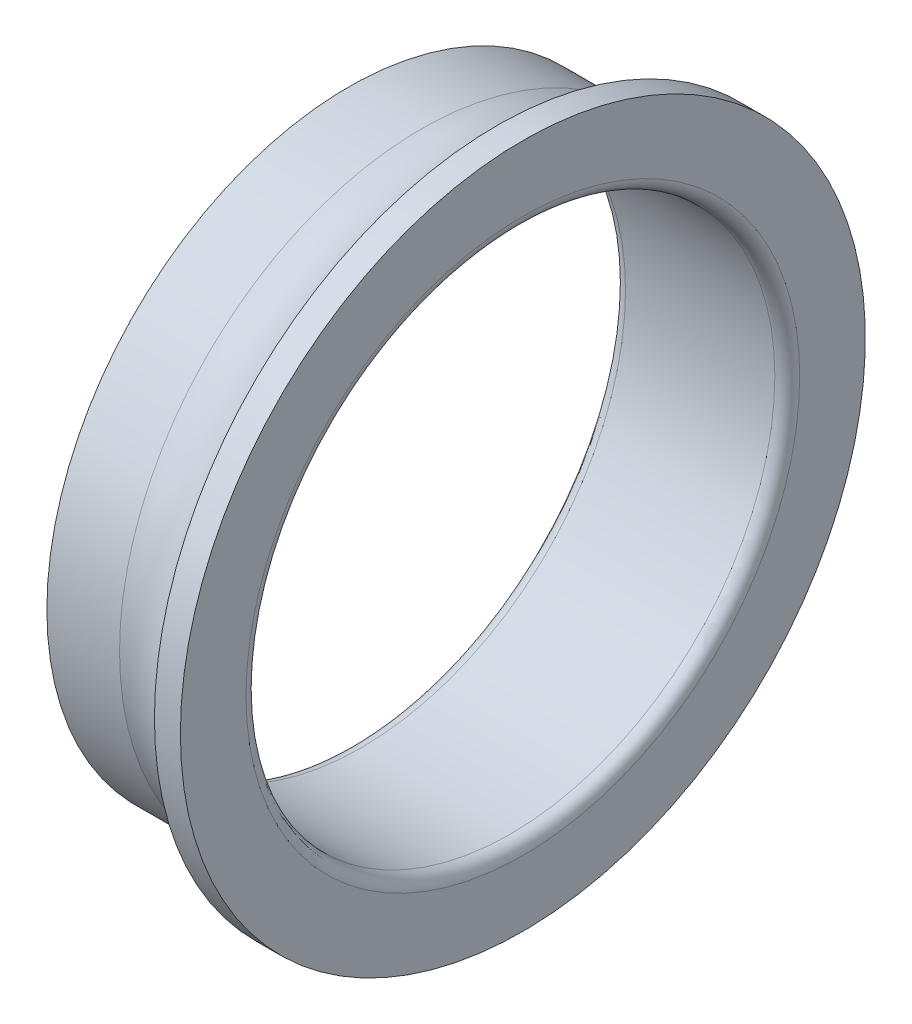
ISO-10303-21;
HEADER;
FILE_DESCRIPTION(('STEP AP214'),'2;1');
FILE_NAME('part.step','',(''),(''),'','','');
FILE_SCHEMA(('AUTOMOTIVE_DESIGN { 1 0 10303 214 1 1 1 1 }'));
ENDSEC;
DATA;
#1=APPLICATION_CONTEXT('core data for automotive mechanical design processes');
#2=APPLICATION_PROTOCOL_DEFINITION('international standard','automotive_design',2000,#1);
#3=PRODUCT_CONTEXT('',#1,'mechanical');
#4=PRODUCT('Part','Part','',(#3));
#5=PRODUCT_RELATED_PRODUCT_CATEGORY('part','',(#4));
#6=PRODUCT_DEFINITION_FORMATION('','',#4);
#7=PRODUCT_DEFINITION_CONTEXT('part definition',#1,'design');
#8=PRODUCT_DEFINITION('design','',#6,#7);
#9=PRODUCT_DEFINITION_SHAPE('','',#8);
#10=(LENGTH_UNIT() NAMED_UNIT(*) SI_UNIT(.MILLI.,.METRE.));
#11=(NAMED_UNIT(*) PLANE_ANGLE_UNIT() SI_UNIT($,.RADIAN.));
#12=(NAMED_UNIT(*) SI_UNIT($,.STERADIAN.) SOLID_ANGLE_UNIT());
#13=UNCERTAINTY_MEASURE_WITH_UNIT(LENGTH_MEASURE(1.E-05),#10,'distance_accuracy_value','');
#14=(GEOMETRIC_REPRESENTATION_CONTEXT(3) GLOBAL_UNCERTAINTY_ASSIGNED_CONTEXT((#13)) GLOBAL_UNIT_ASSIGNED_CONTEXT((#10,
#11,#12)) REPRESENTATION_CONTEXT('',''));
#15=CARTESIAN_POINT('',(0.,0.,0.));
#16=DIRECTION('',(0.,0.,1.));
#17=DIRECTION('',(1.,0.,0.));
#18=AXIS2_PLACEMENT_3D('',#15,#16,#17);
#19=CARTESIAN_POINT('',(28.,0.,0.));
#20=DIRECTION('',(-1.,0.,0.));
#21=DIRECTION('',(0.,0.,1.));
#22=AXIS2_PLACEMENT_3D('',#19,#20,#21);
#23=CYLINDRICAL_SURFACE('',#22,48.51);
#24=CARTESIAN_POINT('',(0.,0.,0.));
#25=DIRECTION('',(-1.,0.,0.));
#26=DIRECTION('',(0.,0.,1.));
#27=AXIS2_PLACEMENT_3D('',#24,#25,#26);
#28=CIRCLE('',#27,48.51);
#29=CARTESIAN_POINT('',(0.,0.,48.51));
#30=VERTEX_POINT('',#29);
#31=EDGE_CURVE('E10',#30,#30,#28,.T.);
#32=ORIENTED_EDGE('',*,*,#31,.F.);
#33=EDGE_LOOP('',(#32));
#34=FACE_BOUND('',#33,.T.);
#35=CARTESIAN_POINT('',(11.677845827685,0.,0.));
#36=DIRECTION('',(-1.,0.,0.));
#37=DIRECTION('',(0.,0.,1.));
#38=AXIS2_PLACEMENT_3D('',#35,#36,#37);
#39=CIRCLE('',#38,48.51);
#40=CARTESIAN_POINT('',(11.677845827685,0.,48.51));
#41=VERTEX_POINT('',#40);
#42=EDGE_CURVE('E59',#41,#41,#39,.T.);
#43=ORIENTED_EDGE('',*,*,#42,.T.);
#44=EDGE_LOOP('',(#43));
#45=FACE_BOUND('',#44,.T.);
#46=ADVANCED_FACE('F31',(#34,#45),#23,.T.);
#47=CARTESIAN_POINT('',(0.,48.51,0.));
#48=DIRECTION('',(1.,0.,0.));
#49=DIRECTION('',(0.,0.,-1.));
#50=AXIS2_PLACEMENT_3D('',#47,#48,#49);
#51=PLANE('',#50);
#52=CARTESIAN_POINT('',(0.,0.,0.));
#53=DIRECTION('',(-1.,0.,0.));
#54=DIRECTION('',(0.,0.,1.));
#55=AXIS2_PLACEMENT_3D('',#52,#53,#54);
#56=CIRCLE('',#55,44.5);
#57=CARTESIAN_POINT('',(0.,0.,44.5));
#58=VERTEX_POINT('',#57);
#59=EDGE_CURVE('E37',#58,#58,#56,.T.);
#60=ORIENTED_EDGE('',*,*,#59,.F.);
#61=EDGE_LOOP('',(#60));
#62=FACE_BOUND('',#61,.T.);
#63=ORIENTED_EDGE('',*,*,#31,.T.);
#64=EDGE_LOOP('',(#63));
#65=FACE_BOUND('',#64,.T.);
#66=ADVANCED_FACE('F96',(#62,#65),#51,.F.);
#67=CARTESIAN_POINT('',(2.00000000000014,0.,0.));
#68=DIRECTION('',(-1.,0.,0.));
#69=DIRECTION('',(0.,0.,1.));
#70=AXIS2_PLACEMENT_3D('',#67,#68,#69);
#71=TOROIDAL_SURFACE('',#70,44.5000000000001,2.00000000000014);
#72=CARTESIAN_POINT('',(2.,0.,0.));
#73=DIRECTION('',(-1.,0.,0.));
#74=DIRECTION('',(0.,0.,1.));
#75=AXIS2_PLACEMENT_3D('',#72,#73,#74);
#76=CIRCLE('',#75,42.5);
#77=CARTESIAN_POINT('',(2.,0.,42.5));
#78=VERTEX_POINT('',#77);
#79=EDGE_CURVE('E41',#78,#78,#76,.T.);
#80=ORIENTED_EDGE('',*,*,#79,.F.);
#81=EDGE_LOOP('',(#80));
#82=FACE_BOUND('',#81,.T.);
#83=ORIENTED_EDGE('',*,*,#59,.T.);
#84=EDGE_LOOP('',(#83));
#85=FACE_BOUND('',#84,.T.);
#86=ADVANCED_FACE('F91',(#82,#85),#71,.T.);
#87=CARTESIAN_POINT('',(28.,0.,0.));
#88=DIRECTION('',(-1.,0.,0.));
#89=DIRECTION('',(0.,0.,1.));
#90=AXIS2_PLACEMENT_3D('',#87,#88,#89);
#91=CYLINDRICAL_SURFACE('',#90,42.5);
#92=CARTESIAN_POINT('',(26.,0.,0.));
#93=DIRECTION('',(-1.,0.,0.));
#94=DIRECTION('',(0.,0.,1.));
#95=AXIS2_PLACEMENT_3D('',#92,#93,#94);
#96=CIRCLE('',#95,42.5);
#97=CARTESIAN_POINT('',(26.,0.,42.5));
#98=VERTEX_POINT('',#97);
#99=EDGE_CURVE('E45',#98,#98,#96,.T.);
#100=ORIENTED_EDGE('',*,*,#99,.F.);
#101=EDGE_LOOP('',(#100));
#102=FACE_BOUND('',#101,.T.);
#103=ORIENTED_EDGE('',*,*,#79,.T.);
#104=EDGE_LOOP('',(#103));
#105=FACE_BOUND('',#104,.T.);
#106=ADVANCED_FACE('F85',(#102,#105),#91,.F.);
#107=CARTESIAN_POINT('',(25.9999999999997,0.,0.));
#108=DIRECTION('',(-1.,0.,0.));
#109=DIRECTION('',(0.,0.,1.));
#110=AXIS2_PLACEMENT_3D('',#107,#108,#109);
#111=TOROIDAL_SURFACE('',#110,44.5000000000003,2.00000000000032);
#112=CARTESIAN_POINT('',(28.,0.,0.));
#113=DIRECTION('',(-1.,0.,0.));
#114=DIRECTION('',(0.,0.,1.));
#115=AXIS2_PLACEMENT_3D('',#112,#113,#114);
#116=CIRCLE('',#115,44.5);
#117=CARTESIAN_POINT('',(28.,0.,44.5));
#118=VERTEX_POINT('',#117);
#119=EDGE_CURVE('E50',#118,#118,#116,.T.);
#120=ORIENTED_EDGE('',*,*,#119,.F.);
#121=EDGE_LOOP('',(#120));
#122=FACE_BOUND('',#121,.T.);
#123=ORIENTED_EDGE('',*,*,#99,.T.);
#124=EDGE_LOOP('',(#123));
#125=FACE_BOUND('',#124,.T.);
#126=ADVANCED_FACE('F79',(#122,#125),#111,.T.);
#127=CARTESIAN_POINT('',(28.,44.5,0.));
#128=DIRECTION('',(-1.,0.,0.));
#129=DIRECTION('',(0.,0.,1.));
#130=AXIS2_PLACEMENT_3D('',#127,#128,#129);
#131=PLANE('',#130);
#132=CARTESIAN_POINT('',(28.,0.,0.));
#133=DIRECTION('',(-1.,0.,0.));
#134=DIRECTION('',(0.,0.,1.));
#135=AXIS2_PLACEMENT_3D('',#132,#133,#134);
#136=CIRCLE('',#135,55.05);
#137=CARTESIAN_POINT('',(28.,0.,55.05));
#138=VERTEX_POINT('',#137);
#139=EDGE_CURVE('E53',#138,#138,#136,.T.);
#140=ORIENTED_EDGE('',*,*,#139,.F.);
#141=EDGE_LOOP('',(#140));
#142=FACE_BOUND('',#141,.T.);
#143=ORIENTED_EDGE('',*,*,#119,.T.);
#144=EDGE_LOOP('',(#143));
#145=FACE_BOUND('',#144,.T.);
#146=ADVANCED_FACE('F73',(#142,#145),#131,.F.);
#147=CARTESIAN_POINT('',(28.,0.,0.));
#148=DIRECTION('',(-1.,0.,0.));
#149=DIRECTION('',(0.,0.,1.));
#150=AXIS2_PLACEMENT_3D('',#147,#148,#149);
#151=CYLINDRICAL_SURFACE('',#150,55.05);
#152=CARTESIAN_POINT('',(23.826494797231,0.,0.));
#153=DIRECTION('',(-1.,0.,0.));
#154=DIRECTION('',(0.,0.,1.));
#155=AXIS2_PLACEMENT_3D('',#152,#153,#154);
#156=CIRCLE('',#155,55.05);
#157=CARTESIAN_POINT('',(23.826494797231,0.,55.05));
#158=VERTEX_POINT('',#157);
#159=EDGE_CURVE('E56',#158,#158,#156,.T.);
#160=ORIENTED_EDGE('',*,*,#159,.F.);
#161=EDGE_LOOP('',(#160));
#162=FACE_BOUND('',#161,.T.);
#163=ORIENTED_EDGE('',*,*,#139,.T.);
#164=EDGE_LOOP('',(#163));
#165=FACE_BOUND('',#164,.T.);
#166=ADVANCED_FACE('F67',(#162,#165),#151,.T.);
#167=CARTESIAN_POINT('',(14.0000000000002,0.,0.));
#168=DIRECTION('',(-1.,0.,0.));
#169=DIRECTION('',(0.,0.,1.));
#170=AXIS2_PLACEMENT_3D('',#167,#168,#169);
#171=TOROIDAL_SURFACE('',#170,58.7500000000003,10.5000000000003);
#172=ORIENTED_EDGE('',*,*,#42,.F.);
#173=EDGE_LOOP('',(#172));
#174=FACE_BOUND('',#173,.T.);
#175=ORIENTED_EDGE('',*,*,#159,.T.);
#176=EDGE_LOOP('',(#175));
#177=FACE_BOUND('',#176,.T.);
#178=ADVANCED_FACE('F64',(#174,#177),#171,.F.);
#179=CLOSED_SHELL('',(#46,#66,#86,#106,#126,#146,#166,#178));
#180=MANIFOLD_SOLID_BREP('B2',#179);
#181=ADVANCED_BREP_SHAPE_REPRESENTATION('',(#18,#180),#14);
#182=SHAPE_DEFINITION_REPRESENTATION(#9,#181);
ENDSEC;
END-ISO-10303-21;
